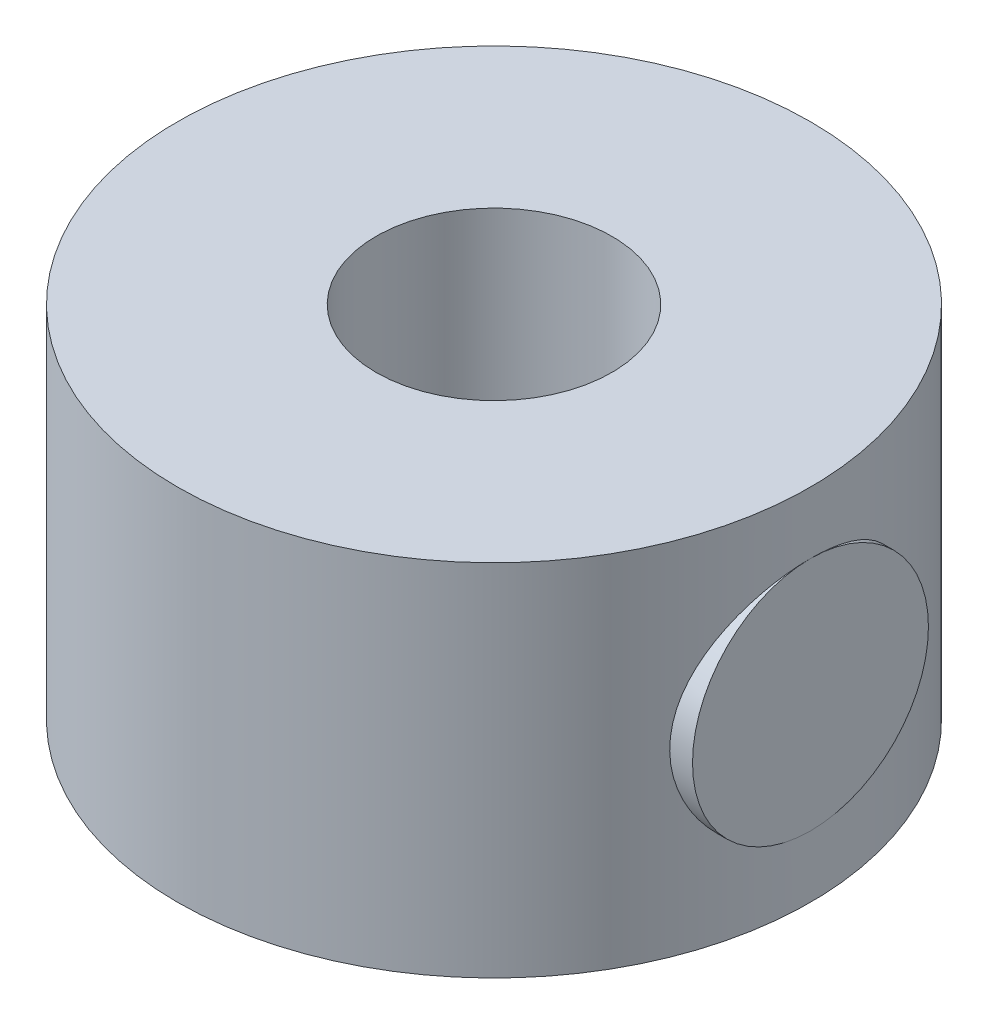
ISO-10303-21;
HEADER;
FILE_DESCRIPTION(('STEP AP214'),'2;1');
FILE_NAME('part.step','',(''),(''),'','','');
FILE_SCHEMA(('AUTOMOTIVE_DESIGN { 1 0 10303 214 1 1 1 1 }'));
ENDSEC;
DATA;
#1=APPLICATION_CONTEXT('core data for automotive mechanical design processes');
#2=APPLICATION_PROTOCOL_DEFINITION('international standard','automotive_design',2000,#1);
#3=PRODUCT_CONTEXT('',#1,'mechanical');
#4=PRODUCT('Part','Part','',(#3));
#5=PRODUCT_RELATED_PRODUCT_CATEGORY('part','',(#4));
#6=PRODUCT_DEFINITION_FORMATION('','',#4);
#7=PRODUCT_DEFINITION_CONTEXT('part definition',#1,'design');
#8=PRODUCT_DEFINITION('design','',#6,#7);
#9=PRODUCT_DEFINITION_SHAPE('','',#8);
#10=(LENGTH_UNIT() NAMED_UNIT(*) SI_UNIT(.MILLI.,.METRE.));
#11=(NAMED_UNIT(*) PLANE_ANGLE_UNIT() SI_UNIT($,.RADIAN.));
#12=(NAMED_UNIT(*) SI_UNIT($,.STERADIAN.) SOLID_ANGLE_UNIT());
#13=UNCERTAINTY_MEASURE_WITH_UNIT(LENGTH_MEASURE(1.E-05),#10,'distance_accuracy_value','');
#14=(GEOMETRIC_REPRESENTATION_CONTEXT(3) GLOBAL_UNCERTAINTY_ASSIGNED_CONTEXT((#13)) GLOBAL_UNIT_ASSIGNED_CONTEXT((#10,
#11,#12)) REPRESENTATION_CONTEXT('',''));
#15=CARTESIAN_POINT('',(0.,0.,0.));
#16=DIRECTION('',(0.,0.,1.));
#17=DIRECTION('',(1.,0.,0.));
#18=AXIS2_PLACEMENT_3D('',#15,#16,#17);
#19=CARTESIAN_POINT('',(0.,6.35,0.));
#20=DIRECTION('',(0.,-1.,0.));
#21=DIRECTION('',(0.,0.,-1.));
#22=AXIS2_PLACEMENT_3D('',#19,#20,#21);
#23=CYLINDRICAL_SURFACE('',#22,5.588);
#24=CARTESIAN_POINT('',(0.,0.,0.));
#25=DIRECTION('',(0.,1.,0.));
#26=DIRECTION('',(0.,0.,1.));
#27=AXIS2_PLACEMENT_3D('',#24,#25,#26);
#28=CIRCLE('',#27,5.588);
#29=CARTESIAN_POINT('',(0.,0.,5.588));
#30=VERTEX_POINT('',#29);
#31=EDGE_CURVE('E42',#30,#30,#28,.T.);
#32=ORIENTED_EDGE('',*,*,#31,.T.);
#33=EDGE_LOOP('',(#32));
#34=FACE_BOUND('',#33,.T.);
#35=CARTESIAN_POINT('',(0.,6.35,0.));
#36=DIRECTION('',(0.,1.,0.));
#37=DIRECTION('',(0.,0.,1.));
#38=AXIS2_PLACEMENT_3D('',#35,#36,#37);
#39=CIRCLE('',#38,5.588);
#40=CARTESIAN_POINT('',(0.,6.35,5.588));
#41=VERTEX_POINT('',#40);
#42=EDGE_CURVE('E11',#41,#41,#39,.T.);
#43=ORIENTED_EDGE('',*,*,#42,.F.);
#44=EDGE_LOOP('',(#43));
#45=FACE_BOUND('',#44,.T.);
#46=CARTESIAN_POINT('',(5.18533394874428,3.175,-2.0828));
#47=CARTESIAN_POINT('',(5.18533026439493,3.28753744314051,-2.0828039771019));
#48=CARTESIAN_POINT('',(5.18903734071872,3.40004848092294,-2.07364874278024));
#49=CARTESIAN_POINT('',(5.20336248295286,3.62168171412557,-2.03743407141016));
#50=CARTESIAN_POINT('',(5.21398040848243,3.73080397833509,-2.01037499804407));
#51=CARTESIAN_POINT('',(5.24076096034366,3.94239834604431,-1.93948056832284));
#52=CARTESIAN_POINT('',(5.25691043578417,4.04488554301992,-1.89568497361648));
#53=CARTESIAN_POINT('',(5.29291338299315,4.24109740477849,-1.79270131181087));
#54=CARTESIAN_POINT('',(5.31276795230348,4.33481946072522,-1.73350868167114));
#55=CARTESIAN_POINT('',(5.35503605645933,4.5154415980236,-1.59829896426674));
#56=CARTESIAN_POINT('',(5.37752425467125,4.60185046226398,-1.52164884782142));
#57=CARTESIAN_POINT('',(5.42190243744724,4.76093300862912,-1.355043544293));
#58=CARTESIAN_POINT('',(5.44379229555285,4.83360380613897,-1.26508556997957));
#59=CARTESIAN_POINT('',(5.48539358532379,4.96550567507282,-1.07069731048055));
#60=CARTESIAN_POINT('',(5.50500726092831,5.02420389171572,-0.965882665475924));
#61=CARTESIAN_POINT('',(5.53894978573687,5.12293115954667,-0.747006347724128));
#62=CARTESIAN_POINT('',(5.5532804436129,5.16296660128863,-0.632947856005343));
#63=CARTESIAN_POINT('',(5.57451229910467,5.22151229776794,-0.403985083158265));
#64=CARTESIAN_POINT('',(5.58170437203972,5.24086799993846,-0.289324480484062));
#65=CARTESIAN_POINT('',(5.58889194911975,5.26021252519843,-0.0581720521818061));
#66=CARTESIAN_POINT('',(5.58888976519003,5.26020756997187,0.058319173128826));
#67=CARTESIAN_POINT('',(5.58187479051995,5.24132578712146,0.283770495944229));
#68=CARTESIAN_POINT('',(5.57520471675925,5.22337151810173,0.392820369480216));
#69=CARTESIAN_POINT('',(5.55605181299864,5.1706511437679,0.606231216179327));
#70=CARTESIAN_POINT('',(5.54356857197348,5.13588384966696,0.710591857213818));
#71=CARTESIAN_POINT('',(5.51380207932336,5.05008972306244,0.91345640150271));
#72=CARTESIAN_POINT('',(5.49645188996663,4.99883456704607,1.01185351592749));
#73=CARTESIAN_POINT('',(5.45871011630697,4.88172090481773,1.19889328680015));
#74=CARTESIAN_POINT('',(5.43831755814749,4.81585771930561,1.28753280401276));
#75=CARTESIAN_POINT('',(5.39520282871059,4.66694081040238,1.45797935357678));
#76=CARTESIAN_POINT('',(5.37241413611128,4.58311284262765,1.53909414257801));
#77=CARTESIAN_POINT('',(5.32802210173647,4.40290366604083,1.68637331620875));
#78=CARTESIAN_POINT('',(5.30641905127467,4.30651939158056,1.75253403894765));
#79=CARTESIAN_POINT('',(5.26642803533631,4.10123341228595,1.86932775363236));
#80=CARTESIAN_POINT('',(5.24811999308777,3.99210549927626,1.91959271372945));
#81=CARTESIAN_POINT('',(5.21771570856419,3.76607216671305,2.00077194280808));
#82=CARTESIAN_POINT('',(5.20561606056717,3.6491710511287,2.03169682316663));
#83=CARTESIAN_POINT('',(5.18980009035503,3.41774353740958,2.07175296057316));
#84=CARTESIAN_POINT('',(5.18566191917767,3.30343626082154,2.08198245386805));
#85=CARTESIAN_POINT('',(5.18504411456622,3.07468853305195,2.08352260069617));
#86=CARTESIAN_POINT('',(5.18856260040102,2.9602481214741,2.07483790018774));
#87=CARTESIAN_POINT('',(5.20243366841094,2.74007840750162,2.0397914897965));
#88=CARTESIAN_POINT('',(5.21245964177081,2.6341918184714,2.01427367673594));
#89=CARTESIAN_POINT('',(5.23783024164905,2.42825002774952,1.94734434663157));
#90=CARTESIAN_POINT('',(5.25317594979265,2.32819601679252,1.90592959718873));
#91=CARTESIAN_POINT('',(5.28815916679883,2.13262247562651,1.80664805401136));
#92=CARTESIAN_POINT('',(5.30793505311871,2.03740992896947,1.74822673186713));
#93=CARTESIAN_POINT('',(5.34931584489504,1.8577491242022,1.61718249909556));
#94=CARTESIAN_POINT('',(5.37092141112353,1.77330478275516,1.54455444532846));
#95=CARTESIAN_POINT('',(5.41515883043202,1.61210462661831,1.38178687043924));
#96=CARTESIAN_POINT('',(5.4377704463052,1.53615902458644,1.29083666960471));
#97=CARTESIAN_POINT('',(5.4801761131747,1.4005135027498,1.09692775019545));
#98=CARTESIAN_POINT('',(5.49997016305614,1.34081358937322,0.993969026869125));
#99=CARTESIAN_POINT('',(5.53449109804637,1.23975904565989,0.779062542152452));
#100=CARTESIAN_POINT('',(5.54923646793671,1.19833732868032,0.667149464079726));
#101=CARTESIAN_POINT('',(5.57205994149511,1.13513666338483,0.437269931746316));
#102=CARTESIAN_POINT('',(5.58014113562088,1.1133486096809,0.319306310365867));
#103=CARTESIAN_POINT('',(5.58843628854079,1.09100668203981,0.0880021140292924));
#104=CARTESIAN_POINT('',(5.58907694649035,1.08930104084539,-0.0252129104738455));
#105=CARTESIAN_POINT('',(5.58352785003195,1.10421663645941,-0.250246817967476));
#106=CARTESIAN_POINT('',(5.57733890265274,1.12083570790539,-0.362065864336577));
#107=CARTESIAN_POINT('',(5.55901856670357,1.17112218292531,-0.578425716359792));
#108=CARTESIAN_POINT('',(5.54703253396469,1.20437322101173,-0.683076536559369));
#109=CARTESIAN_POINT('',(5.51836827154502,1.28656700439999,-0.885324247260115));
#110=CARTESIAN_POINT('',(5.50168915422461,1.33551271840278,-0.982919798950077));
#111=CARTESIAN_POINT('',(5.46444337657093,1.450035773259,-1.17275399502206));
#112=CARTESIAN_POINT('',(5.44374335495357,1.51622281837168,-1.2645981739347));
#113=CARTESIAN_POINT('',(5.4010012399613,1.66238431962688,-1.43623330565103));
#114=CARTESIAN_POINT('',(5.37895867172855,1.74236367263255,-1.51601995857119));
#115=CARTESIAN_POINT('',(5.334614897174,1.91878466590222,-1.6655415749588));
#116=CARTESIAN_POINT('',(5.31235981765535,2.01586597229663,-1.73453835217819));
#117=CARTESIAN_POINT('',(5.27141564432849,2.22094913649539,-1.85526289237452));
#118=CARTESIAN_POINT('',(5.25272683787644,2.32895187323355,-1.90698926402208));
#119=CARTESIAN_POINT('',(5.22071777197939,2.55738666833604,-1.99300289461501));
#120=CARTESIAN_POINT('',(5.20763294198707,2.67813779345466,-2.02653880724127));
#121=CARTESIAN_POINT('',(5.18994578553867,2.92427220169862,-2.07142807549868));
#122=CARTESIAN_POINT('',(5.18533805248114,3.04965248030508,-2.08279557018674));
#123=CARTESIAN_POINT('',(5.18533394874428,3.175,-2.0828));
#124=B_SPLINE_CURVE_WITH_KNOTS('',3,(#46,#47,#48,#49,#50,#51,#52,#53,#54,#55,#56,#57,#58,#59,
#60,#61,#62,#63,#64,#65,#66,#67,#68,#69,#70,#71,#72,#73,#74,#75,#76,#77,#78,#79,#80,#81,#82,#83,
#84,#85,#86,#87,#88,#89,#90,#91,#92,#93,#94,#95,#96,#97,#98,#99,#100,#101,#102,#103,#104,#105,
#106,#107,#108,#109,#110,#111,#112,#113,#114,#115,#116,#117,#118,#119,#120,#121,#122,#123),
.UNSPECIFIED.,.T.,.F.,(4,2,2,2,2,2,2,2,2,2,2,2,2,2,2,2,2,2,2,2,2,2,2,2,2,2,2,2,2,2,2,2,2,2,2,2,
2,2,4),(0.,0.33714571243079,0.674284576599631,1.01062741584825,1.3470700469072,1.69852973710698,
2.05006314237557,2.41339344014106,2.77659923388491,3.12430981649159,3.47190865985593,
3.80251522069248,4.13314516091504,4.4685664177188,4.80409527352258,5.15904117049467,
5.51407389122687,5.87680938764899,6.2393456859335,6.58207772952031,6.92472559615439,
7.25138218424866,7.57810522818207,7.91697806272698,8.25597380427146,8.61615341681875,
8.97633317188387,9.33517973099575,9.69385978418252,10.031861359847,10.3698229994146,
10.6997183918148,11.0296762218889,11.3734268725221,11.71729982166,12.0790495779219,
12.4408284702505,12.8165910381097,13.192113865443),.UNSPECIFIED.);
#125=CARTESIAN_POINT('',(5.588,1.0922,0.));
#126=VERTEX_POINT('',#125);
#127=CARTESIAN_POINT('',(5.588,5.2578,0.));
#128=VERTEX_POINT('',#127);
#129=EDGE_CURVE('E59',#126,#128,#124,.T.);
#130=ORIENTED_EDGE('',*,*,#129,.F.);
#131=CARTESIAN_POINT('',(5.18533394874428,3.175,-2.0828));
#132=CARTESIAN_POINT('',(5.18533026439493,3.28753744314051,-2.0828039771019));
#133=CARTESIAN_POINT('',(5.18903734071872,3.40004848092294,-2.07364874278024));
#134=CARTESIAN_POINT('',(5.20336248295286,3.62168171412557,-2.03743407141016));
#135=CARTESIAN_POINT('',(5.21398040848243,3.73080397833509,-2.01037499804407));
#136=CARTESIAN_POINT('',(5.24076096034366,3.94239834604431,-1.93948056832284));
#137=CARTESIAN_POINT('',(5.25691043578417,4.04488554301992,-1.89568497361648));
#138=CARTESIAN_POINT('',(5.29291338299315,4.24109740477849,-1.79270131181087));
#139=CARTESIAN_POINT('',(5.31276795230348,4.33481946072522,-1.73350868167114));
#140=CARTESIAN_POINT('',(5.35503605645933,4.5154415980236,-1.59829896426674));
#141=CARTESIAN_POINT('',(5.37752425467125,4.60185046226398,-1.52164884782142));
#142=CARTESIAN_POINT('',(5.42190243744724,4.76093300862912,-1.355043544293));
#143=CARTESIAN_POINT('',(5.44379229555285,4.83360380613897,-1.26508556997957));
#144=CARTESIAN_POINT('',(5.48539358532379,4.96550567507282,-1.07069731048055));
#145=CARTESIAN_POINT('',(5.50500726092831,5.02420389171572,-0.965882665475924));
#146=CARTESIAN_POINT('',(5.53894978573687,5.12293115954667,-0.747006347724128));
#147=CARTESIAN_POINT('',(5.5532804436129,5.16296660128863,-0.632947856005343));
#148=CARTESIAN_POINT('',(5.57451229910467,5.22151229776794,-0.403985083158265));
#149=CARTESIAN_POINT('',(5.58170437203972,5.24086799993846,-0.289324480484062));
#150=CARTESIAN_POINT('',(5.58889194911975,5.26021252519843,-0.0581720521818061));
#151=CARTESIAN_POINT('',(5.58888976519003,5.26020756997187,0.058319173128826));
#152=CARTESIAN_POINT('',(5.58187479051995,5.24132578712146,0.283770495944229));
#153=CARTESIAN_POINT('',(5.57520471675925,5.22337151810173,0.392820369480216));
#154=CARTESIAN_POINT('',(5.55605181299864,5.1706511437679,0.606231216179327));
#155=CARTESIAN_POINT('',(5.54356857197348,5.13588384966696,0.710591857213818));
#156=CARTESIAN_POINT('',(5.51380207932336,5.05008972306244,0.91345640150271));
#157=CARTESIAN_POINT('',(5.49645188996663,4.99883456704607,1.01185351592749));
#158=CARTESIAN_POINT('',(5.45871011630697,4.88172090481773,1.19889328680015));
#159=CARTESIAN_POINT('',(5.43831755814749,4.81585771930561,1.28753280401276));
#160=CARTESIAN_POINT('',(5.39520282871059,4.66694081040238,1.45797935357678));
#161=CARTESIAN_POINT('',(5.37241413611128,4.58311284262765,1.53909414257801));
#162=CARTESIAN_POINT('',(5.32802210173647,4.40290366604083,1.68637331620875));
#163=CARTESIAN_POINT('',(5.30641905127467,4.30651939158056,1.75253403894765));
#164=CARTESIAN_POINT('',(5.26642803533631,4.10123341228595,1.86932775363236));
#165=CARTESIAN_POINT('',(5.24811999308777,3.99210549927626,1.91959271372945));
#166=CARTESIAN_POINT('',(5.21771570856419,3.76607216671305,2.00077194280808));
#167=CARTESIAN_POINT('',(5.20561606056717,3.6491710511287,2.03169682316663));
#168=CARTESIAN_POINT('',(5.18980009035503,3.41774353740958,2.07175296057316));
#169=CARTESIAN_POINT('',(5.18566191917767,3.30343626082154,2.08198245386805));
#170=CARTESIAN_POINT('',(5.18504411456622,3.07468853305195,2.08352260069617));
#171=CARTESIAN_POINT('',(5.18856260040102,2.9602481214741,2.07483790018774));
#172=CARTESIAN_POINT('',(5.20243366841094,2.74007840750162,2.0397914897965));
#173=CARTESIAN_POINT('',(5.21245964177081,2.6341918184714,2.01427367673594));
#174=CARTESIAN_POINT('',(5.23783024164905,2.42825002774952,1.94734434663157));
#175=CARTESIAN_POINT('',(5.25317594979265,2.32819601679252,1.90592959718873));
#176=CARTESIAN_POINT('',(5.28815916679883,2.13262247562651,1.80664805401136));
#177=CARTESIAN_POINT('',(5.30793505311871,2.03740992896947,1.74822673186713));
#178=CARTESIAN_POINT('',(5.34931584489504,1.8577491242022,1.61718249909556));
#179=CARTESIAN_POINT('',(5.37092141112353,1.77330478275516,1.54455444532846));
#180=CARTESIAN_POINT('',(5.41515883043202,1.61210462661831,1.38178687043924));
#181=CARTESIAN_POINT('',(5.4377704463052,1.53615902458644,1.29083666960471));
#182=CARTESIAN_POINT('',(5.4801761131747,1.4005135027498,1.09692775019545));
#183=CARTESIAN_POINT('',(5.49997016305614,1.34081358937322,0.993969026869125));
#184=CARTESIAN_POINT('',(5.53449109804637,1.23975904565989,0.779062542152452));
#185=CARTESIAN_POINT('',(5.54923646793671,1.19833732868032,0.667149464079726));
#186=CARTESIAN_POINT('',(5.57205994149511,1.13513666338483,0.437269931746316));
#187=CARTESIAN_POINT('',(5.58014113562088,1.1133486096809,0.319306310365867));
#188=CARTESIAN_POINT('',(5.58843628854079,1.09100668203981,0.0880021140292924));
#189=CARTESIAN_POINT('',(5.58907694649035,1.08930104084539,-0.0252129104738455));
#190=CARTESIAN_POINT('',(5.58352785003195,1.10421663645941,-0.250246817967476));
#191=CARTESIAN_POINT('',(5.57733890265274,1.12083570790539,-0.362065864336577));
#192=CARTESIAN_POINT('',(5.55901856670357,1.17112218292531,-0.578425716359792));
#193=CARTESIAN_POINT('',(5.54703253396469,1.20437322101173,-0.683076536559369));
#194=CARTESIAN_POINT('',(5.51836827154502,1.28656700439999,-0.885324247260115));
#195=CARTESIAN_POINT('',(5.50168915422461,1.33551271840278,-0.982919798950077));
#196=CARTESIAN_POINT('',(5.46444337657093,1.450035773259,-1.17275399502206));
#197=CARTESIAN_POINT('',(5.44374335495357,1.51622281837168,-1.2645981739347));
#198=CARTESIAN_POINT('',(5.4010012399613,1.66238431962688,-1.43623330565103));
#199=CARTESIAN_POINT('',(5.37895867172855,1.74236367263255,-1.51601995857119));
#200=CARTESIAN_POINT('',(5.334614897174,1.91878466590222,-1.6655415749588));
#201=CARTESIAN_POINT('',(5.31235981765535,2.01586597229663,-1.73453835217819));
#202=CARTESIAN_POINT('',(5.27141564432849,2.22094913649539,-1.85526289237452));
#203=CARTESIAN_POINT('',(5.25272683787644,2.32895187323355,-1.90698926402208));
#204=CARTESIAN_POINT('',(5.22071777197939,2.55738666833604,-1.99300289461501));
#205=CARTESIAN_POINT('',(5.20763294198707,2.67813779345466,-2.02653880724127));
#206=CARTESIAN_POINT('',(5.18994578553867,2.92427220169862,-2.07142807549868));
#207=CARTESIAN_POINT('',(5.18533805248114,3.04965248030508,-2.08279557018674));
#208=CARTESIAN_POINT('',(5.18533394874428,3.175,-2.0828));
#209=B_SPLINE_CURVE_WITH_KNOTS('',3,(#131,#132,#133,#134,#135,#136,#137,#138,#139,#140,#141,
#142,#143,#144,#145,#146,#147,#148,#149,#150,#151,#152,#153,#154,#155,#156,#157,#158,#159,#160,
#161,#162,#163,#164,#165,#166,#167,#168,#169,#170,#171,#172,#173,#174,#175,#176,#177,#178,#179,
#180,#181,#182,#183,#184,#185,#186,#187,#188,#189,#190,#191,#192,#193,#194,#195,#196,#197,#198,
#199,#200,#201,#202,#203,#204,#205,#206,#207,#208),.UNSPECIFIED.,.T.,.F.,(4,2,2,2,2,2,2,2,2,2,2,
2,2,2,2,2,2,2,2,2,2,2,2,2,2,2,2,2,2,2,2,2,2,2,2,2,2,2,4),(0.,0.33714571243079,0.674284576599631,
1.01062741584825,1.3470700469072,1.69852973710698,2.05006314237557,2.41339344014106,
2.77659923388491,3.12430981649159,3.47190865985593,3.80251522069248,4.13314516091504,
4.4685664177188,4.80409527352258,5.15904117049467,5.51407389122687,5.87680938764899,
6.2393456859335,6.58207772952031,6.92472559615439,7.25138218424866,7.57810522818207,
7.91697806272698,8.25597380427146,8.61615341681875,8.97633317188387,9.33517973099575,
9.69385978418252,10.031861359847,10.3698229994146,10.6997183918148,11.0296762218889,
11.3734268725221,11.71729982166,12.0790495779219,12.4408284702505,12.8165910381097,
13.192113865443),.UNSPECIFIED.);
#210=EDGE_CURVE('E60',#128,#126,#209,.T.);
#211=ORIENTED_EDGE('',*,*,#210,.F.);
#212=EDGE_LOOP('',(#130,#211));
#213=FACE_BOUND('',#212,.T.);
#214=ADVANCED_FACE('F39',(#34,#45,#213),#23,.T.);
#215=CARTESIAN_POINT('',(0.,6.35,0.));
#216=DIRECTION('',(0.,1.,0.));
#217=DIRECTION('',(0.,0.,1.));
#218=AXIS2_PLACEMENT_3D('',#215,#216,#217);
#219=PLANE('',#218);
#220=ORIENTED_EDGE('',*,*,#42,.T.);
#221=EDGE_LOOP('',(#220));
#222=FACE_BOUND('',#221,.T.);
#223=CARTESIAN_POINT('',(0.,6.35,0.));
#224=DIRECTION('',(0.,1.,0.));
#225=DIRECTION('',(0.,0.,1.));
#226=AXIS2_PLACEMENT_3D('',#223,#224,#225);
#227=CIRCLE('',#226,2.0828);
#228=CARTESIAN_POINT('',(0.,6.35,2.0828));
#229=VERTEX_POINT('',#228);
#230=EDGE_CURVE('E111',#229,#229,#227,.T.);
#231=ORIENTED_EDGE('',*,*,#230,.F.);
#232=EDGE_LOOP('',(#231));
#233=FACE_BOUND('',#232,.T.);
#234=ADVANCED_FACE('F97',(#222,#233),#219,.T.);
#235=CARTESIAN_POINT('',(0.,0.,0.));
#236=DIRECTION('',(0.,1.,0.));
#237=DIRECTION('',(0.,0.,1.));
#238=AXIS2_PLACEMENT_3D('',#235,#236,#237);
#239=PLANE('',#238);
#240=ORIENTED_EDGE('',*,*,#31,.F.);
#241=EDGE_LOOP('',(#240));
#242=FACE_BOUND('',#241,.T.);
#243=CARTESIAN_POINT('',(0.,0.,0.));
#244=DIRECTION('',(0.,1.,0.));
#245=DIRECTION('',(0.,0.,1.));
#246=AXIS2_PLACEMENT_3D('',#243,#244,#245);
#247=CIRCLE('',#246,2.0828);
#248=CARTESIAN_POINT('',(0.,0.,2.0828));
#249=VERTEX_POINT('',#248);
#250=EDGE_CURVE('E66',#249,#249,#247,.T.);
#251=ORIENTED_EDGE('',*,*,#250,.T.);
#252=EDGE_LOOP('',(#251));
#253=FACE_BOUND('',#252,.T.);
#254=ADVANCED_FACE('F94',(#242,#253),#239,.F.);
#255=CARTESIAN_POINT('',(0.,6.35,0.));
#256=DIRECTION('',(0.,-1.,0.));
#257=DIRECTION('',(0.,0.,-1.));
#258=AXIS2_PLACEMENT_3D('',#255,#256,#257);
#259=CYLINDRICAL_SURFACE('',#258,2.0828);
#260=ORIENTED_EDGE('',*,*,#230,.T.);
#261=EDGE_LOOP('',(#260));
#262=FACE_BOUND('',#261,.T.);
#263=ORIENTED_EDGE('',*,*,#250,.F.);
#264=EDGE_LOOP('',(#263));
#265=FACE_BOUND('',#264,.T.);
#266=ADVANCED_FACE('F89',(#262,#265),#259,.F.);
#267=CARTESIAN_POINT('',(5.588,3.175,0.));
#268=DIRECTION('',(1.,0.,0.));
#269=DIRECTION('',(0.,0.,-1.));
#270=AXIS2_PLACEMENT_3D('',#267,#268,#269);
#271=PLANE('',#270);
#272=CARTESIAN_POINT('',(5.588,3.175,0.));
#273=DIRECTION('',(1.,0.,0.));
#274=DIRECTION('',(0.,0.,-1.));
#275=AXIS2_PLACEMENT_3D('',#272,#273,#274);
#276=CIRCLE('',#275,2.0828);
#277=EDGE_CURVE('E52',#126,#128,#276,.T.);
#278=ORIENTED_EDGE('',*,*,#277,.T.);
#279=CARTESIAN_POINT('',(5.588,3.175,0.));
#280=DIRECTION('',(1.,0.,0.));
#281=DIRECTION('',(0.,0.,-1.));
#282=AXIS2_PLACEMENT_3D('',#279,#280,#281);
#283=CIRCLE('',#282,2.0828);
#284=EDGE_CURVE('E58',#128,#126,#283,.T.);
#285=ORIENTED_EDGE('',*,*,#284,.T.);
#286=EDGE_LOOP('',(#278,#285));
#287=FACE_BOUND('',#286,.T.);
#288=ADVANCED_FACE('F56',(#287),#271,.T.);
#289=CARTESIAN_POINT('',(-5.589,3.175,0.));
#290=DIRECTION('',(1.,0.,0.));
#291=DIRECTION('',(0.,0.,-1.));
#292=AXIS2_PLACEMENT_3D('',#289,#290,#291);
#293=CYLINDRICAL_SURFACE('',#292,2.0828);
#294=ORIENTED_EDGE('',*,*,#277,.F.);
#295=ORIENTED_EDGE('',*,*,#129,.T.);
#296=EDGE_LOOP('',(#294,#295));
#297=FACE_BOUND('',#296,.T.);
#298=ADVANCED_FACE('F63',(#297),#293,.T.);
#299=CARTESIAN_POINT('',(-5.589,3.175,0.));
#300=DIRECTION('',(1.,0.,0.));
#301=DIRECTION('',(0.,0.,-1.));
#302=AXIS2_PLACEMENT_3D('',#299,#300,#301);
#303=CYLINDRICAL_SURFACE('',#302,2.0828);
#304=ORIENTED_EDGE('',*,*,#284,.F.);
#305=ORIENTED_EDGE('',*,*,#210,.T.);
#306=EDGE_LOOP('',(#304,#305));
#307=FACE_BOUND('',#306,.T.);
#308=ADVANCED_FACE('F70',(#307),#303,.T.);
#309=CLOSED_SHELL('',(#214,#234,#254,#266,#288,#298,#308));
#310=MANIFOLD_SOLID_BREP('B2',#309);
#311=ADVANCED_BREP_SHAPE_REPRESENTATION('',(#18,#310),#14);
#312=SHAPE_DEFINITION_REPRESENTATION(#9,#311);
ENDSEC;
END-ISO-10303-21;
